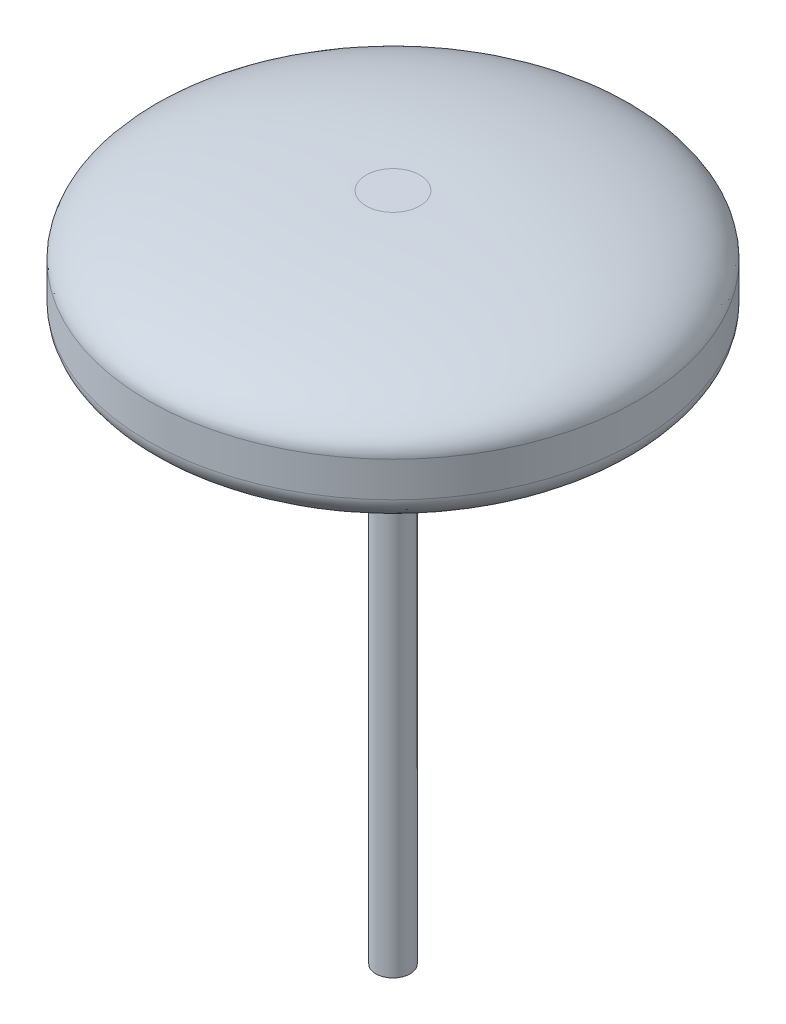
ISO-10303-21;
HEADER;
FILE_DESCRIPTION(('STEP AP214'),'2;1');
FILE_NAME('part.step','',(''),(''),'','','');
FILE_SCHEMA(('AUTOMOTIVE_DESIGN { 1 0 10303 214 1 1 1 1 }'));
ENDSEC;
DATA;
#1=APPLICATION_CONTEXT('core data for automotive mechanical design processes');
#2=APPLICATION_PROTOCOL_DEFINITION('international standard','automotive_design',2000,#1);
#3=PRODUCT_CONTEXT('',#1,'mechanical');
#4=PRODUCT('Part','Part','',(#3));
#5=PRODUCT_RELATED_PRODUCT_CATEGORY('part','',(#4));
#6=PRODUCT_DEFINITION_FORMATION('','',#4);
#7=PRODUCT_DEFINITION_CONTEXT('part definition',#1,'design');
#8=PRODUCT_DEFINITION('design','',#6,#7);
#9=PRODUCT_DEFINITION_SHAPE('','',#8);
#10=(LENGTH_UNIT() NAMED_UNIT(*) SI_UNIT(.MILLI.,.METRE.));
#11=(NAMED_UNIT(*) PLANE_ANGLE_UNIT() SI_UNIT($,.RADIAN.));
#12=(NAMED_UNIT(*) SI_UNIT($,.STERADIAN.) SOLID_ANGLE_UNIT());
#13=UNCERTAINTY_MEASURE_WITH_UNIT(LENGTH_MEASURE(1.E-05),#10,'distance_accuracy_value','');
#14=(GEOMETRIC_REPRESENTATION_CONTEXT(3) GLOBAL_UNCERTAINTY_ASSIGNED_CONTEXT((#13)) GLOBAL_UNIT_ASSIGNED_CONTEXT((#10,
#11,#12)) REPRESENTATION_CONTEXT('',''));
#15=CARTESIAN_POINT('',(0.,0.,0.));
#16=DIRECTION('',(0.,0.,1.));
#17=DIRECTION('',(1.,0.,0.));
#18=AXIS2_PLACEMENT_3D('',#15,#16,#17);
#19=CARTESIAN_POINT('',(3.12110955186266,-9.,0.));
#20=DIRECTION('',(0.,-1.,0.));
#21=DIRECTION('',(0.,0.,-1.));
#22=AXIS2_PLACEMENT_3D('',#19,#20,#21);
#23=PLANE('',#22);
#24=CARTESIAN_POINT('',(0.,-9.,0.));
#25=DIRECTION('',(0.,-1.,0.));
#26=DIRECTION('',(0.,0.,-1.));
#27=AXIS2_PLACEMENT_3D('',#24,#25,#26);
#28=CIRCLE('',#27,3.12110955186266);
#29=CARTESIAN_POINT('',(0.,-9.,-3.12110955186266));
#30=VERTEX_POINT('',#29);
#31=EDGE_CURVE('E47',#30,#30,#28,.T.);
#32=ORIENTED_EDGE('',*,*,#31,.T.);
#33=EDGE_LOOP('',(#32));
#34=FACE_BOUND('',#33,.T.);
#35=CARTESIAN_POINT('',(0.,-9.,0.));
#36=DIRECTION('',(0.,-1.,0.));
#37=DIRECTION('',(0.,0.,-1.));
#38=AXIS2_PLACEMENT_3D('',#35,#36,#37);
#39=CIRCLE('',#38,2.);
#40=CARTESIAN_POINT('',(0.,-9.,-2.));
#41=VERTEX_POINT('',#40);
#42=EDGE_CURVE('E93',#41,#41,#39,.T.);
#43=ORIENTED_EDGE('',*,*,#42,.F.);
#44=EDGE_LOOP('',(#43));
#45=FACE_BOUND('',#44,.T.);
#46=ADVANCED_FACE('F31',(#34,#45),#23,.T.);
#47=CARTESIAN_POINT('',(3.12110955186262,-9.,0.));
#48=CARTESIAN_POINT('',(17.4526507630727,-9.00000000000001,0.));
#49=CARTESIAN_POINT('',(28.5,-5.98005620796911,0.));
#50=CARTESIAN_POINT('',(28.5,-2.04421242950415,0.));
#51=B_SPLINE_CURVE_WITH_KNOTS('',3,(#47,#48,#49,#50),.UNSPECIFIED.,.F.,.F.,(4,4),(0.,1.),.UNSPECIFIED.);
#52=CARTESIAN_POINT('',(0.,0.,0.));
#53=DIRECTION('',(0.,-1.,0.));
#54=AXIS1_PLACEMENT('',#52,#53);
#55=SURFACE_OF_REVOLUTION('',#51,#54);
#56=CARTESIAN_POINT('',(0.,-2.04421242950415,0.));
#57=DIRECTION('',(0.,-1.,0.));
#58=DIRECTION('',(0.,0.,-1.));
#59=AXIS2_PLACEMENT_3D('',#56,#57,#58);
#60=CIRCLE('',#59,28.5);
#61=CARTESIAN_POINT('',(0.,-2.04421242950415,-28.5));
#62=VERTEX_POINT('',#61);
#63=EDGE_CURVE('E10',#62,#62,#60,.T.);
#64=ORIENTED_EDGE('',*,*,#63,.T.);
#65=EDGE_LOOP('',(#64));
#66=FACE_BOUND('',#65,.T.);
#67=ORIENTED_EDGE('',*,*,#31,.F.);
#68=EDGE_LOOP('',(#67));
#69=FACE_BOUND('',#68,.T.);
#70=ADVANCED_FACE('F33',(#66,#69),#55,.F.);
#71=CARTESIAN_POINT('',(0.,0.,0.));
#72=DIRECTION('',(0.,-1.,0.));
#73=DIRECTION('',(0.,0.,-1.));
#74=AXIS2_PLACEMENT_3D('',#71,#72,#73);
#75=CYLINDRICAL_SURFACE('',#74,28.5);
#76=CARTESIAN_POINT('',(0.,2.04421242950415,0.));
#77=DIRECTION('',(0.,-1.,0.));
#78=DIRECTION('',(0.,0.,-1.));
#79=AXIS2_PLACEMENT_3D('',#76,#77,#78);
#80=CIRCLE('',#79,28.5);
#81=CARTESIAN_POINT('',(0.,2.04421242950415,-28.5));
#82=VERTEX_POINT('',#81);
#83=EDGE_CURVE('E39',#82,#82,#80,.T.);
#84=ORIENTED_EDGE('',*,*,#83,.T.);
#85=EDGE_LOOP('',(#84));
#86=FACE_BOUND('',#85,.T.);
#87=ORIENTED_EDGE('',*,*,#63,.F.);
#88=EDGE_LOOP('',(#87));
#89=FACE_BOUND('',#88,.T.);
#90=ADVANCED_FACE('F68',(#86,#89),#75,.T.);
#91=CARTESIAN_POINT('',(28.5,2.04421242950415,0.));
#92=CARTESIAN_POINT('',(28.5,5.98005620796911,0.));
#93=CARTESIAN_POINT('',(17.4526507630727,9.00000000000001,0.));
#94=CARTESIAN_POINT('',(3.12110955186262,9.,0.));
#95=B_SPLINE_CURVE_WITH_KNOTS('',3,(#91,#92,#93,#94),.UNSPECIFIED.,.F.,.F.,(4,4),(0.,1.),.UNSPECIFIED.);
#96=CARTESIAN_POINT('',(0.,0.,0.));
#97=DIRECTION('',(0.,-1.,0.));
#98=AXIS1_PLACEMENT('',#96,#97);
#99=SURFACE_OF_REVOLUTION('',#95,#98);
#100=CARTESIAN_POINT('',(0.,9.,0.));
#101=DIRECTION('',(0.,-1.,0.));
#102=DIRECTION('',(0.,0.,-1.));
#103=AXIS2_PLACEMENT_3D('',#100,#101,#102);
#104=CIRCLE('',#103,3.12110955186262);
#105=CARTESIAN_POINT('',(0.,9.,-3.12110955186262));
#106=VERTEX_POINT('',#105);
#107=EDGE_CURVE('E43',#106,#106,#104,.T.);
#108=ORIENTED_EDGE('',*,*,#107,.T.);
#109=EDGE_LOOP('',(#108));
#110=FACE_BOUND('',#109,.T.);
#111=ORIENTED_EDGE('',*,*,#83,.F.);
#112=EDGE_LOOP('',(#111));
#113=FACE_BOUND('',#112,.T.);
#114=ADVANCED_FACE('F64',(#110,#113),#99,.F.);
#115=CARTESIAN_POINT('',(3.12110955186266,9.,0.));
#116=DIRECTION('',(0.,1.,0.));
#117=DIRECTION('',(0.,0.,1.));
#118=AXIS2_PLACEMENT_3D('',#115,#116,#117);
#119=PLANE('',#118);
#120=ORIENTED_EDGE('',*,*,#107,.F.);
#121=EDGE_LOOP('',(#120));
#122=FACE_BOUND('',#121,.T.);
#123=ADVANCED_FACE('F67',(#122),#119,.T.);
#124=CARTESIAN_POINT('',(0.,-69.,0.));
#125=DIRECTION('',(0.,1.,0.));
#126=DIRECTION('',(0.,0.,1.));
#127=AXIS2_PLACEMENT_3D('',#124,#125,#126);
#128=CYLINDRICAL_SURFACE('',#127,2.);
#129=CARTESIAN_POINT('',(0.,-69.,0.));
#130=DIRECTION('',(0.,-1.,0.));
#131=DIRECTION('',(0.,0.,-1.));
#132=AXIS2_PLACEMENT_3D('',#129,#130,#131);
#133=CIRCLE('',#132,2.);
#134=CARTESIAN_POINT('',(0.,-69.,-2.));
#135=VERTEX_POINT('',#134);
#136=EDGE_CURVE('E52',#135,#135,#133,.T.);
#137=ORIENTED_EDGE('',*,*,#136,.F.);
#138=EDGE_LOOP('',(#137));
#139=FACE_BOUND('',#138,.T.);
#140=ORIENTED_EDGE('',*,*,#42,.T.);
#141=EDGE_LOOP('',(#140));
#142=FACE_BOUND('',#141,.T.);
#143=ADVANCED_FACE('F82',(#139,#142),#128,.T.);
#144=CARTESIAN_POINT('',(0.,-69.,0.));
#145=DIRECTION('',(0.,-1.,0.));
#146=DIRECTION('',(0.,0.,-1.));
#147=AXIS2_PLACEMENT_3D('',#144,#145,#146);
#148=PLANE('',#147);
#149=ORIENTED_EDGE('',*,*,#136,.T.);
#150=EDGE_LOOP('',(#149));
#151=FACE_BOUND('',#150,.T.);
#152=ADVANCED_FACE('F85',(#151),#148,.T.);
#153=CLOSED_SHELL('',(#46,#70,#90,#114,#123,#143,#152));
#154=MANIFOLD_SOLID_BREP('B2',#153);
#155=ADVANCED_BREP_SHAPE_REPRESENTATION('',(#18,#154),#14);
#156=SHAPE_DEFINITION_REPRESENTATION(#9,#155);
ENDSEC;
END-ISO-10303-21;
